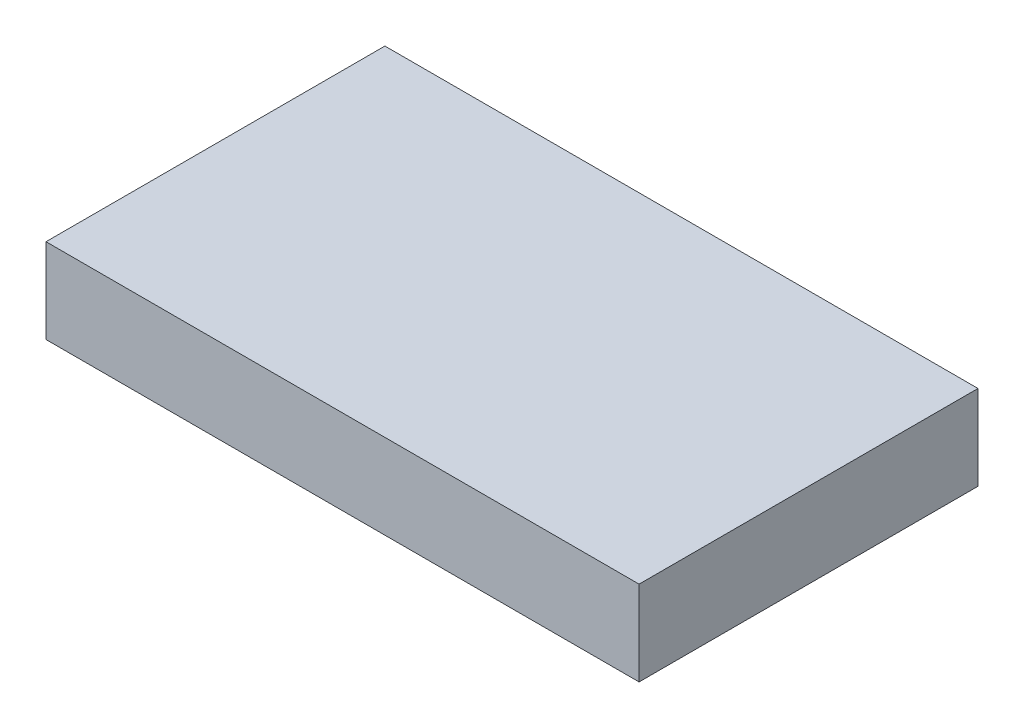
ISO-10303-21;
HEADER;
FILE_DESCRIPTION(('STEP AP214'),'2;1');
FILE_NAME('part.step','',(''),(''),'','','');
FILE_SCHEMA(('AUTOMOTIVE_DESIGN { 1 0 10303 214 1 1 1 1 }'));
ENDSEC;
DATA;
#1=APPLICATION_CONTEXT('core data for automotive mechanical design processes');
#2=APPLICATION_PROTOCOL_DEFINITION('international standard','automotive_design',2000,#1);
#3=PRODUCT_CONTEXT('',#1,'mechanical');
#4=PRODUCT('Part','Part','',(#3));
#5=PRODUCT_RELATED_PRODUCT_CATEGORY('part','',(#4));
#6=PRODUCT_DEFINITION_FORMATION('','',#4);
#7=PRODUCT_DEFINITION_CONTEXT('part definition',#1,'design');
#8=PRODUCT_DEFINITION('design','',#6,#7);
#9=PRODUCT_DEFINITION_SHAPE('','',#8);
#10=(LENGTH_UNIT() NAMED_UNIT(*) SI_UNIT(.MILLI.,.METRE.));
#11=(NAMED_UNIT(*) PLANE_ANGLE_UNIT() SI_UNIT($,.RADIAN.));
#12=(NAMED_UNIT(*) SI_UNIT($,.STERADIAN.) SOLID_ANGLE_UNIT());
#13=UNCERTAINTY_MEASURE_WITH_UNIT(LENGTH_MEASURE(1.E-05),#10,'distance_accuracy_value','');
#14=(GEOMETRIC_REPRESENTATION_CONTEXT(3) GLOBAL_UNCERTAINTY_ASSIGNED_CONTEXT((#13)) GLOBAL_UNIT_ASSIGNED_CONTEXT((#10,
#11,#12)) REPRESENTATION_CONTEXT('',''));
#15=CARTESIAN_POINT('',(0.,0.,0.));
#16=DIRECTION('',(0.,0.,1.));
#17=DIRECTION('',(1.,0.,0.));
#18=AXIS2_PLACEMENT_3D('',#15,#16,#17);
#19=CARTESIAN_POINT('',(0.,0.,20.));
#20=DIRECTION('',(1.,0.,0.));
#21=DIRECTION('',(0.,0.,-1.));
#22=AXIS2_PLACEMENT_3D('',#19,#20,#21);
#23=PLANE('',#22);
#24=DIRECTION('',(0.,-1.,0.));
#25=VECTOR('',#24,1.);
#26=CARTESIAN_POINT('',(0.,0.,0.));
#27=LINE('',#26,#25);
#28=CARTESIAN_POINT('',(0.,5.,0.));
#29=VERTEX_POINT('',#28);
#30=CARTESIAN_POINT('',(0.,0.,0.));
#31=VERTEX_POINT('',#30);
#32=EDGE_CURVE('E105',#29,#31,#27,.T.);
#33=ORIENTED_EDGE('',*,*,#32,.T.);
#34=DIRECTION('',(0.,0.,-1.));
#35=VECTOR('',#34,1.);
#36=CARTESIAN_POINT('',(0.,0.,20.));
#37=LINE('',#36,#35);
#38=CARTESIAN_POINT('',(0.,0.,20.));
#39=VERTEX_POINT('',#38);
#40=EDGE_CURVE('E11',#39,#31,#37,.T.);
#41=ORIENTED_EDGE('',*,*,#40,.F.);
#42=DIRECTION('',(0.,-1.,0.));
#43=VECTOR('',#42,1.);
#44=CARTESIAN_POINT('',(0.,0.,20.));
#45=LINE('',#44,#43);
#46=CARTESIAN_POINT('',(0.,5.,20.));
#47=VERTEX_POINT('',#46);
#48=EDGE_CURVE('E89',#47,#39,#45,.T.);
#49=ORIENTED_EDGE('',*,*,#48,.F.);
#50=DIRECTION('',(0.,0.,-1.));
#51=VECTOR('',#50,1.);
#52=CARTESIAN_POINT('',(0.,5.,20.));
#53=LINE('',#52,#51);
#54=EDGE_CURVE('E97',#47,#29,#53,.T.);
#55=ORIENTED_EDGE('',*,*,#54,.T.);
#56=EDGE_LOOP('',(#33,#41,#49,#55));
#57=FACE_BOUND('',#56,.T.);
#58=ADVANCED_FACE('F39',(#57),#23,.F.);
#59=CARTESIAN_POINT('',(0.,0.,20.));
#60=DIRECTION('',(0.,1.,0.));
#61=DIRECTION('',(0.,0.,1.));
#62=AXIS2_PLACEMENT_3D('',#59,#60,#61);
#63=PLANE('',#62);
#64=DIRECTION('',(1.,0.,0.));
#65=VECTOR('',#64,1.);
#66=CARTESIAN_POINT('',(0.,0.,0.));
#67=LINE('',#66,#65);
#68=CARTESIAN_POINT('',(35.,0.,0.));
#69=VERTEX_POINT('',#68);
#70=EDGE_CURVE('E92',#31,#69,#67,.T.);
#71=ORIENTED_EDGE('',*,*,#70,.T.);
#72=DIRECTION('',(0.,0.,-1.));
#73=VECTOR('',#72,1.);
#74=CARTESIAN_POINT('',(35.,0.,20.));
#75=LINE('',#74,#73);
#76=CARTESIAN_POINT('',(35.,0.,20.));
#77=VERTEX_POINT('',#76);
#78=EDGE_CURVE('E50',#77,#69,#75,.T.);
#79=ORIENTED_EDGE('',*,*,#78,.F.);
#80=DIRECTION('',(1.,0.,0.));
#81=VECTOR('',#80,1.);
#82=CARTESIAN_POINT('',(0.,0.,20.));
#83=LINE('',#82,#81);
#84=EDGE_CURVE('E82',#39,#77,#83,.T.);
#85=ORIENTED_EDGE('',*,*,#84,.F.);
#86=ORIENTED_EDGE('',*,*,#40,.T.);
#87=EDGE_LOOP('',(#71,#79,#85,#86));
#88=FACE_BOUND('',#87,.T.);
#89=ADVANCED_FACE('F93',(#88),#63,.F.);
#90=CARTESIAN_POINT('',(35.,0.,20.));
#91=DIRECTION('',(-1.,0.,0.));
#92=DIRECTION('',(0.,0.,1.));
#93=AXIS2_PLACEMENT_3D('',#90,#91,#92);
#94=PLANE('',#93);
#95=DIRECTION('',(0.,1.,0.));
#96=VECTOR('',#95,1.);
#97=CARTESIAN_POINT('',(35.,0.,0.));
#98=LINE('',#97,#96);
#99=CARTESIAN_POINT('',(35.,5.,0.));
#100=VERTEX_POINT('',#99);
#101=EDGE_CURVE('E72',#69,#100,#98,.T.);
#102=ORIENTED_EDGE('',*,*,#101,.T.);
#103=DIRECTION('',(0.,0.,-1.));
#104=VECTOR('',#103,1.);
#105=CARTESIAN_POINT('',(35.,5.,20.));
#106=LINE('',#105,#104);
#107=CARTESIAN_POINT('',(35.,5.,20.));
#108=VERTEX_POINT('',#107);
#109=EDGE_CURVE('E94',#108,#100,#106,.T.);
#110=ORIENTED_EDGE('',*,*,#109,.F.);
#111=DIRECTION('',(0.,1.,0.));
#112=VECTOR('',#111,1.);
#113=CARTESIAN_POINT('',(35.,0.,20.));
#114=LINE('',#113,#112);
#115=EDGE_CURVE('E88',#77,#108,#114,.T.);
#116=ORIENTED_EDGE('',*,*,#115,.F.);
#117=ORIENTED_EDGE('',*,*,#78,.T.);
#118=EDGE_LOOP('',(#102,#110,#116,#117));
#119=FACE_BOUND('',#118,.T.);
#120=ADVANCED_FACE('F96',(#119),#94,.F.);
#121=CARTESIAN_POINT('',(0.,5.,20.));
#122=DIRECTION('',(0.,-1.,0.));
#123=DIRECTION('',(0.,0.,-1.));
#124=AXIS2_PLACEMENT_3D('',#121,#122,#123);
#125=PLANE('',#124);
#126=DIRECTION('',(-1.,0.,0.));
#127=VECTOR('',#126,1.);
#128=CARTESIAN_POINT('',(0.,5.,0.));
#129=LINE('',#128,#127);
#130=EDGE_CURVE('E76',#100,#29,#129,.T.);
#131=ORIENTED_EDGE('',*,*,#130,.T.);
#132=ORIENTED_EDGE('',*,*,#54,.F.);
#133=DIRECTION('',(-1.,0.,0.));
#134=VECTOR('',#133,1.);
#135=CARTESIAN_POINT('',(0.,5.,20.));
#136=LINE('',#135,#134);
#137=EDGE_CURVE('E54',#108,#47,#136,.T.);
#138=ORIENTED_EDGE('',*,*,#137,.F.);
#139=ORIENTED_EDGE('',*,*,#109,.T.);
#140=EDGE_LOOP('',(#131,#132,#138,#139));
#141=FACE_BOUND('',#140,.T.);
#142=ADVANCED_FACE('F108',(#141),#125,.F.);
#143=CARTESIAN_POINT('',(0.,0.,20.));
#144=DIRECTION('',(0.,0.,-1.));
#145=DIRECTION('',(-1.,0.,0.));
#146=AXIS2_PLACEMENT_3D('',#143,#144,#145);
#147=PLANE('',#146);
#148=ORIENTED_EDGE('',*,*,#48,.T.);
#149=ORIENTED_EDGE('',*,*,#84,.T.);
#150=ORIENTED_EDGE('',*,*,#115,.T.);
#151=ORIENTED_EDGE('',*,*,#137,.T.);
#152=EDGE_LOOP('',(#148,#149,#150,#151));
#153=FACE_BOUND('',#152,.T.);
#154=ADVANCED_FACE('F86',(#153),#147,.F.);
#155=CARTESIAN_POINT('',(0.,0.,0.));
#156=DIRECTION('',(0.,0.,-1.));
#157=DIRECTION('',(-1.,0.,0.));
#158=AXIS2_PLACEMENT_3D('',#155,#156,#157);
#159=PLANE('',#158);
#160=ORIENTED_EDGE('',*,*,#32,.F.);
#161=ORIENTED_EDGE('',*,*,#130,.F.);
#162=ORIENTED_EDGE('',*,*,#101,.F.);
#163=ORIENTED_EDGE('',*,*,#70,.F.);
#164=EDGE_LOOP('',(#160,#161,#162,#163));
#165=FACE_BOUND('',#164,.T.);
#166=ADVANCED_FACE('F115',(#165),#159,.T.);
#167=CLOSED_SHELL('',(#58,#89,#120,#142,#154,#166));
#168=MANIFOLD_SOLID_BREP('B2',#167);
#169=ADVANCED_BREP_SHAPE_REPRESENTATION('',(#18,#168),#14);
#170=SHAPE_DEFINITION_REPRESENTATION(#9,#169);
ENDSEC;
END-ISO-10303-21;
